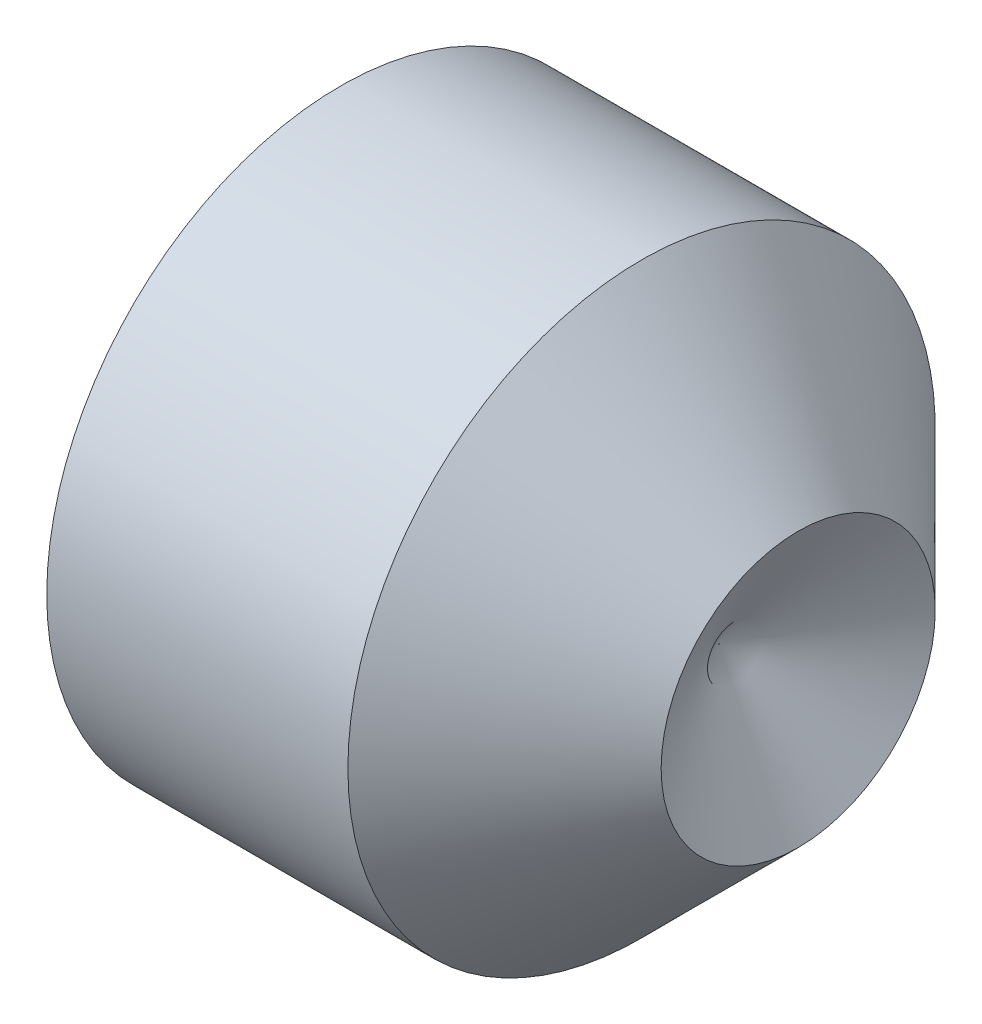
ISO-10303-21;
HEADER;
FILE_DESCRIPTION(('STEP AP214'),'2;1');
FILE_NAME('part.step','',(''),(''),'','','');
FILE_SCHEMA(('AUTOMOTIVE_DESIGN { 1 0 10303 214 1 1 1 1 }'));
ENDSEC;
DATA;
#1=APPLICATION_CONTEXT('core data for automotive mechanical design processes');
#2=APPLICATION_PROTOCOL_DEFINITION('international standard','automotive_design',2000,#1);
#3=PRODUCT_CONTEXT('',#1,'mechanical');
#4=PRODUCT('Part','Part','',(#3));
#5=PRODUCT_RELATED_PRODUCT_CATEGORY('part','',(#4));
#6=PRODUCT_DEFINITION_FORMATION('','',#4);
#7=PRODUCT_DEFINITION_CONTEXT('part definition',#1,'design');
#8=PRODUCT_DEFINITION('design','',#6,#7);
#9=PRODUCT_DEFINITION_SHAPE('','',#8);
#10=(LENGTH_UNIT() NAMED_UNIT(*) SI_UNIT(.MILLI.,.METRE.));
#11=(NAMED_UNIT(*) PLANE_ANGLE_UNIT() SI_UNIT($,.RADIAN.));
#12=(NAMED_UNIT(*) SI_UNIT($,.STERADIAN.) SOLID_ANGLE_UNIT());
#13=UNCERTAINTY_MEASURE_WITH_UNIT(LENGTH_MEASURE(1.E-05),#10,'distance_accuracy_value','');
#14=(GEOMETRIC_REPRESENTATION_CONTEXT(3) GLOBAL_UNCERTAINTY_ASSIGNED_CONTEXT((#13)) GLOBAL_UNIT_ASSIGNED_CONTEXT((#10,
#11,#12)) REPRESENTATION_CONTEXT('',''));
#15=CARTESIAN_POINT('',(0.,0.,0.));
#16=DIRECTION('',(0.,0.,1.));
#17=DIRECTION('',(1.,0.,0.));
#18=AXIS2_PLACEMENT_3D('',#15,#16,#17);
#19=CARTESIAN_POINT('',(0.,0.,0.));
#20=DIRECTION('',(-1.,0.,0.));
#21=DIRECTION('',(0.,0.,1.));
#22=AXIS2_PLACEMENT_3D('',#19,#20,#21);
#23=PLANE('',#22);
#24=CARTESIAN_POINT('',(0.,0.,0.));
#25=DIRECTION('',(-1.,0.,0.));
#26=DIRECTION('',(0.,0.,1.));
#27=AXIS2_PLACEMENT_3D('',#24,#25,#26);
#28=CIRCLE('',#27,1.2195);
#29=CARTESIAN_POINT('',(0.,0.,1.2195));
#30=VERTEX_POINT('',#29);
#31=EDGE_CURVE('E11',#30,#30,#28,.T.);
#32=ORIENTED_EDGE('',*,*,#31,.T.);
#33=EDGE_LOOP('',(#32));
#34=FACE_BOUND('',#33,.T.);
#35=DIRECTION('',(0.,0.,-1.));
#36=VECTOR('',#35,1.);
#37=CARTESIAN_POINT('',(0.,0.75,0.43301270189222));
#38=LINE('',#37,#36);
#39=CARTESIAN_POINT('',(0.,0.75,0.43301270189222));
#40=VERTEX_POINT('',#39);
#41=CARTESIAN_POINT('',(0.,0.75,-0.433012701892219));
#42=VERTEX_POINT('',#41);
#43=EDGE_CURVE('E106',#40,#42,#38,.T.);
#44=ORIENTED_EDGE('',*,*,#43,.F.);
#45=DIRECTION('',(0.,-0.866025403784438,0.5));
#46=VECTOR('',#45,1.);
#47=CARTESIAN_POINT('',(0.,0.75,0.43301270189222));
#48=LINE('',#47,#46);
#49=CARTESIAN_POINT('',(0.,0.,0.866025403784439));
#50=VERTEX_POINT('',#49);
#51=EDGE_CURVE('E59',#40,#50,#48,.T.);
#52=ORIENTED_EDGE('',*,*,#51,.T.);
#53=DIRECTION('',(0.,0.866025403784438,0.5));
#54=VECTOR('',#53,1.);
#55=CARTESIAN_POINT('',(0.,-0.750000000000001,0.43301270189222));
#56=LINE('',#55,#54);
#57=CARTESIAN_POINT('',(0.,-0.750000000000001,0.43301270189222));
#58=VERTEX_POINT('',#57);
#59=EDGE_CURVE('E112',#58,#50,#56,.T.);
#60=ORIENTED_EDGE('',*,*,#59,.F.);
#61=DIRECTION('',(0.,0.,-1.));
#62=VECTOR('',#61,1.);
#63=CARTESIAN_POINT('',(0.,-0.750000000000001,0.43301270189222));
#64=LINE('',#63,#62);
#65=CARTESIAN_POINT('',(0.,-0.750000000000001,-0.433012701892219));
#66=VERTEX_POINT('',#65);
#67=EDGE_CURVE('E132',#58,#66,#64,.T.);
#68=ORIENTED_EDGE('',*,*,#67,.T.);
#69=DIRECTION('',(0.,0.866025403784438,-0.500000000000001));
#70=VECTOR('',#69,1.);
#71=CARTESIAN_POINT('',(0.,-0.750000000000001,-0.433012701892219));
#72=LINE('',#71,#70);
#73=CARTESIAN_POINT('',(0.,0.,-0.866025403784439));
#74=VERTEX_POINT('',#73);
#75=EDGE_CURVE('E135',#66,#74,#72,.T.);
#76=ORIENTED_EDGE('',*,*,#75,.T.);
#77=DIRECTION('',(0.,-0.866025403784438,-0.500000000000001));
#78=VECTOR('',#77,1.);
#79=CARTESIAN_POINT('',(0.,0.75,-0.433012701892219));
#80=LINE('',#79,#78);
#81=EDGE_CURVE('E138',#42,#74,#80,.T.);
#82=ORIENTED_EDGE('',*,*,#81,.F.);
#83=EDGE_LOOP('',(#44,#52,#60,#68,#76,#82));
#84=FACE_BOUND('',#83,.T.);
#85=ADVANCED_FACE('F45',(#34,#84),#23,.T.);
#86=CARTESIAN_POINT('',(0.,0.,0.));
#87=DIRECTION('',(1.,0.,0.));
#88=DIRECTION('',(0.,0.,-1.));
#89=AXIS2_PLACEMENT_3D('',#86,#87,#88);
#90=CONICAL_SURFACE('',#89,1.2195,1.0471975511966);
#91=CARTESIAN_POINT('',(0.161946750507689,0.,0.));
#92=DIRECTION('',(-1.,0.,0.));
#93=DIRECTION('',(0.,0.,1.));
#94=AXIS2_PLACEMENT_3D('',#91,#92,#93);
#95=CIRCLE('',#94,1.5);
#96=CARTESIAN_POINT('',(0.161946750507689,0.,1.5));
#97=VERTEX_POINT('',#96);
#98=EDGE_CURVE('E52',#97,#97,#95,.T.);
#99=ORIENTED_EDGE('',*,*,#98,.T.);
#100=EDGE_LOOP('',(#99));
#101=FACE_BOUND('',#100,.T.);
#102=ORIENTED_EDGE('',*,*,#31,.F.);
#103=EDGE_LOOP('',(#102));
#104=FACE_BOUND('',#103,.T.);
#105=ADVANCED_FACE('F158',(#101,#104),#90,.T.);
#106=CARTESIAN_POINT('',(-12.7,0.,0.));
#107=DIRECTION('',(-1.,0.,0.));
#108=DIRECTION('',(0.,0.,1.));
#109=AXIS2_PLACEMENT_3D('',#106,#107,#108);
#110=CYLINDRICAL_SURFACE('',#109,1.5);
#111=CARTESIAN_POINT('',(1.70000000000001,0.,0.));
#112=DIRECTION('',(-1.,0.,0.));
#113=DIRECTION('',(0.,0.,1.));
#114=AXIS2_PLACEMENT_3D('',#111,#112,#113);
#115=CIRCLE('',#114,1.5);
#116=CARTESIAN_POINT('',(1.70000000000001,0.,1.5));
#117=VERTEX_POINT('',#116);
#118=EDGE_CURVE('E153',#117,#117,#115,.T.);
#119=ORIENTED_EDGE('',*,*,#118,.T.);
#120=EDGE_LOOP('',(#119));
#121=FACE_BOUND('',#120,.T.);
#122=ORIENTED_EDGE('',*,*,#98,.F.);
#123=EDGE_LOOP('',(#122));
#124=FACE_BOUND('',#123,.T.);
#125=ADVANCED_FACE('F161',(#121,#124),#110,.T.);
#126=CARTESIAN_POINT('',(1.70000000000001,0.,0.));
#127=DIRECTION('',(-1.,0.,0.));
#128=DIRECTION('',(0.,0.,1.));
#129=AXIS2_PLACEMENT_3D('',#126,#127,#128);
#130=CONICAL_SURFACE('',#129,1.5,0.785398163397451);
#131=CARTESIAN_POINT('',(2.5,0.,0.));
#132=DIRECTION('',(-1.,0.,0.));
#133=DIRECTION('',(0.,0.,1.));
#134=AXIS2_PLACEMENT_3D('',#131,#132,#133);
#135=CIRCLE('',#134,0.7);
#136=CARTESIAN_POINT('',(2.5,0.,0.7));
#137=VERTEX_POINT('',#136);
#138=EDGE_CURVE('E113',#137,#137,#135,.T.);
#139=ORIENTED_EDGE('',*,*,#138,.T.);
#140=EDGE_LOOP('',(#139));
#141=FACE_BOUND('',#140,.T.);
#142=ORIENTED_EDGE('',*,*,#118,.F.);
#143=EDGE_LOOP('',(#142));
#144=FACE_BOUND('',#143,.T.);
#145=ADVANCED_FACE('F163',(#141,#144),#130,.T.);
#146=CARTESIAN_POINT('',(2.09585481156726,0.,0.));
#147=DIRECTION('',(1.,0.,0.));
#148=DIRECTION('',(0.,0.,-1.));
#149=AXIS2_PLACEMENT_3D('',#146,#147,#148);
#150=CONICAL_SURFACE('',#149,0.,1.04719755119659);
#151=ORIENTED_EDGE('',*,*,#138,.F.);
#152=EDGE_LOOP('',(#151));
#153=FACE_BOUND('',#152,.T.);
#154=CARTESIAN_POINT('',(2.09585481156726,0.,0.));
#155=VERTEX_POINT('',#154);
#156=VERTEX_LOOP('',#155);
#157=FACE_BOUND('',#156,.T.);
#158=ADVANCED_FACE('F170',(#153,#157),#150,.F.);
#159=CARTESIAN_POINT('',(1.2,0.75,0.43301270189222));
#160=DIRECTION('',(0.,-0.5,-0.866025403784439));
#161=DIRECTION('',(0.,0.866025403784439,-0.5));
#162=AXIS2_PLACEMENT_3D('',#159,#160,#161);
#163=PLANE('',#162);
#164=ORIENTED_EDGE('',*,*,#51,.F.);
#165=DIRECTION('',(-1.,0.,0.));
#166=VECTOR('',#165,1.);
#167=CARTESIAN_POINT('',(1.2,0.75,0.43301270189222));
#168=LINE('',#167,#166);
#169=CARTESIAN_POINT('',(1.2,0.75,0.43301270189222));
#170=VERTEX_POINT('',#169);
#171=EDGE_CURVE('E100',#170,#40,#168,.T.);
#172=ORIENTED_EDGE('',*,*,#171,.F.);
#173=DIRECTION('',(0.,-0.866025403784438,0.5));
#174=VECTOR('',#173,1.);
#175=CARTESIAN_POINT('',(1.2,0.75,0.43301270189222));
#176=LINE('',#175,#174);
#177=CARTESIAN_POINT('',(1.2,0.,0.866025403784439));
#178=VERTEX_POINT('',#177);
#179=EDGE_CURVE('E95',#170,#178,#176,.T.);
#180=ORIENTED_EDGE('',*,*,#179,.T.);
#181=DIRECTION('',(-1.,0.,0.));
#182=VECTOR('',#181,1.);
#183=CARTESIAN_POINT('',(1.2,0.,0.866025403784439));
#184=LINE('',#183,#182);
#185=EDGE_CURVE('E98',#178,#50,#184,.T.);
#186=ORIENTED_EDGE('',*,*,#185,.T.);
#187=EDGE_LOOP('',(#164,#172,#180,#186));
#188=FACE_BOUND('',#187,.T.);
#189=ADVANCED_FACE('F97',(#188),#163,.T.);
#190=CARTESIAN_POINT('',(1.2,-0.750000000000001,0.43301270189222));
#191=DIRECTION('',(0.,-0.5,0.866025403784439));
#192=DIRECTION('',(0.,-0.866025403784439,-0.5));
#193=AXIS2_PLACEMENT_3D('',#190,#191,#192);
#194=PLANE('',#193);
#195=ORIENTED_EDGE('',*,*,#59,.T.);
#196=ORIENTED_EDGE('',*,*,#185,.F.);
#197=DIRECTION('',(0.,0.866025403784438,0.5));
#198=VECTOR('',#197,1.);
#199=CARTESIAN_POINT('',(1.2,-0.750000000000001,0.43301270189222));
#200=LINE('',#199,#198);
#201=CARTESIAN_POINT('',(1.2,-0.750000000000001,0.43301270189222));
#202=VERTEX_POINT('',#201);
#203=EDGE_CURVE('E105',#202,#178,#200,.T.);
#204=ORIENTED_EDGE('',*,*,#203,.F.);
#205=DIRECTION('',(-1.,0.,0.));
#206=VECTOR('',#205,1.);
#207=CARTESIAN_POINT('',(1.2,-0.750000000000001,0.43301270189222));
#208=LINE('',#207,#206);
#209=EDGE_CURVE('E114',#202,#58,#208,.T.);
#210=ORIENTED_EDGE('',*,*,#209,.T.);
#211=EDGE_LOOP('',(#195,#196,#204,#210));
#212=FACE_BOUND('',#211,.T.);
#213=ADVANCED_FACE('F110',(#212),#194,.F.);
#214=CARTESIAN_POINT('',(1.2,-0.750000000000001,0.43301270189222));
#215=DIRECTION('',(0.,1.,0.));
#216=DIRECTION('',(0.,0.,1.));
#217=AXIS2_PLACEMENT_3D('',#214,#215,#216);
#218=PLANE('',#217);
#219=ORIENTED_EDGE('',*,*,#67,.F.);
#220=ORIENTED_EDGE('',*,*,#209,.F.);
#221=DIRECTION('',(0.,0.,-1.));
#222=VECTOR('',#221,1.);
#223=CARTESIAN_POINT('',(1.2,-0.750000000000001,0.43301270189222));
#224=LINE('',#223,#222);
#225=CARTESIAN_POINT('',(1.2,-0.750000000000001,-0.433012701892219));
#226=VERTEX_POINT('',#225);
#227=EDGE_CURVE('E119',#202,#226,#224,.T.);
#228=ORIENTED_EDGE('',*,*,#227,.T.);
#229=DIRECTION('',(-1.,0.,0.));
#230=VECTOR('',#229,1.);
#231=CARTESIAN_POINT('',(1.2,-0.750000000000001,-0.433012701892219));
#232=LINE('',#231,#230);
#233=EDGE_CURVE('E148',#226,#66,#232,.T.);
#234=ORIENTED_EDGE('',*,*,#233,.T.);
#235=EDGE_LOOP('',(#219,#220,#228,#234));
#236=FACE_BOUND('',#235,.T.);
#237=ADVANCED_FACE('F196',(#236),#218,.T.);
#238=CARTESIAN_POINT('',(1.2,-0.750000000000001,-0.433012701892219));
#239=DIRECTION('',(0.,0.500000000000001,0.866025403784438));
#240=DIRECTION('',(0.,-0.866025403784438,0.500000000000001));
#241=AXIS2_PLACEMENT_3D('',#238,#239,#240);
#242=PLANE('',#241);
#243=ORIENTED_EDGE('',*,*,#75,.F.);
#244=ORIENTED_EDGE('',*,*,#233,.F.);
#245=DIRECTION('',(0.,0.866025403784438,-0.500000000000001));
#246=VECTOR('',#245,1.);
#247=CARTESIAN_POINT('',(1.2,-0.750000000000001,-0.433012701892219));
#248=LINE('',#247,#246);
#249=CARTESIAN_POINT('',(1.2,0.,-0.866025403784439));
#250=VERTEX_POINT('',#249);
#251=EDGE_CURVE('E121',#226,#250,#248,.T.);
#252=ORIENTED_EDGE('',*,*,#251,.T.);
#253=DIRECTION('',(-1.,0.,0.));
#254=VECTOR('',#253,1.);
#255=CARTESIAN_POINT('',(1.2,0.,-0.866025403784439));
#256=LINE('',#255,#254);
#257=EDGE_CURVE('E146',#250,#74,#256,.T.);
#258=ORIENTED_EDGE('',*,*,#257,.T.);
#259=EDGE_LOOP('',(#243,#244,#252,#258));
#260=FACE_BOUND('',#259,.T.);
#261=ADVANCED_FACE('F192',(#260),#242,.T.);
#262=CARTESIAN_POINT('',(1.2,0.75,-0.433012701892219));
#263=DIRECTION('',(0.,0.5,-0.866025403784438));
#264=DIRECTION('',(0.,0.866025403784438,0.500000000000001));
#265=AXIS2_PLACEMENT_3D('',#262,#263,#264);
#266=PLANE('',#265);
#267=ORIENTED_EDGE('',*,*,#81,.T.);
#268=ORIENTED_EDGE('',*,*,#257,.F.);
#269=DIRECTION('',(0.,-0.866025403784438,-0.500000000000001));
#270=VECTOR('',#269,1.);
#271=CARTESIAN_POINT('',(1.2,0.75,-0.433012701892219));
#272=LINE('',#271,#270);
#273=CARTESIAN_POINT('',(1.2,0.75,-0.433012701892219));
#274=VERTEX_POINT('',#273);
#275=EDGE_CURVE('E125',#274,#250,#272,.T.);
#276=ORIENTED_EDGE('',*,*,#275,.F.);
#277=DIRECTION('',(-1.,0.,0.));
#278=VECTOR('',#277,1.);
#279=CARTESIAN_POINT('',(1.2,0.75,-0.433012701892219));
#280=LINE('',#279,#278);
#281=EDGE_CURVE('E144',#274,#42,#280,.T.);
#282=ORIENTED_EDGE('',*,*,#281,.T.);
#283=EDGE_LOOP('',(#267,#268,#276,#282));
#284=FACE_BOUND('',#283,.T.);
#285=ADVANCED_FACE('F189',(#284),#266,.F.);
#286=CARTESIAN_POINT('',(1.2,0.75,0.43301270189222));
#287=DIRECTION('',(0.,1.,0.));
#288=DIRECTION('',(0.,0.,1.));
#289=AXIS2_PLACEMENT_3D('',#286,#287,#288);
#290=PLANE('',#289);
#291=ORIENTED_EDGE('',*,*,#43,.T.);
#292=ORIENTED_EDGE('',*,*,#281,.F.);
#293=DIRECTION('',(0.,0.,-1.));
#294=VECTOR('',#293,1.);
#295=CARTESIAN_POINT('',(1.2,0.75,0.43301270189222));
#296=LINE('',#295,#294);
#297=EDGE_CURVE('E128',#170,#274,#296,.T.);
#298=ORIENTED_EDGE('',*,*,#297,.F.);
#299=ORIENTED_EDGE('',*,*,#171,.T.);
#300=EDGE_LOOP('',(#291,#292,#298,#299));
#301=FACE_BOUND('',#300,.T.);
#302=ADVANCED_FACE('F185',(#301),#290,.F.);
#303=CARTESIAN_POINT('',(1.2,1.5,0.));
#304=DIRECTION('',(1.,0.,0.));
#305=DIRECTION('',(0.,0.,-1.));
#306=AXIS2_PLACEMENT_3D('',#303,#304,#305);
#307=PLANE('',#306);
#308=ORIENTED_EDGE('',*,*,#179,.F.);
#309=ORIENTED_EDGE('',*,*,#297,.T.);
#310=ORIENTED_EDGE('',*,*,#275,.T.);
#311=ORIENTED_EDGE('',*,*,#251,.F.);
#312=ORIENTED_EDGE('',*,*,#227,.F.);
#313=ORIENTED_EDGE('',*,*,#203,.T.);
#314=EDGE_LOOP('',(#308,#309,#310,#311,#312,#313));
#315=FACE_BOUND('',#314,.T.);
#316=ADVANCED_FACE('F117',(#315),#307,.F.);
#317=CLOSED_SHELL('',(#85,#105,#125,#145,#158,#189,#213,#237,#261,#285,#302,#316));
#318=MANIFOLD_SOLID_BREP('B2',#317);
#319=ADVANCED_BREP_SHAPE_REPRESENTATION('',(#18,#318),#14);
#320=SHAPE_DEFINITION_REPRESENTATION(#9,#319);
ENDSEC;
END-ISO-10303-21;
